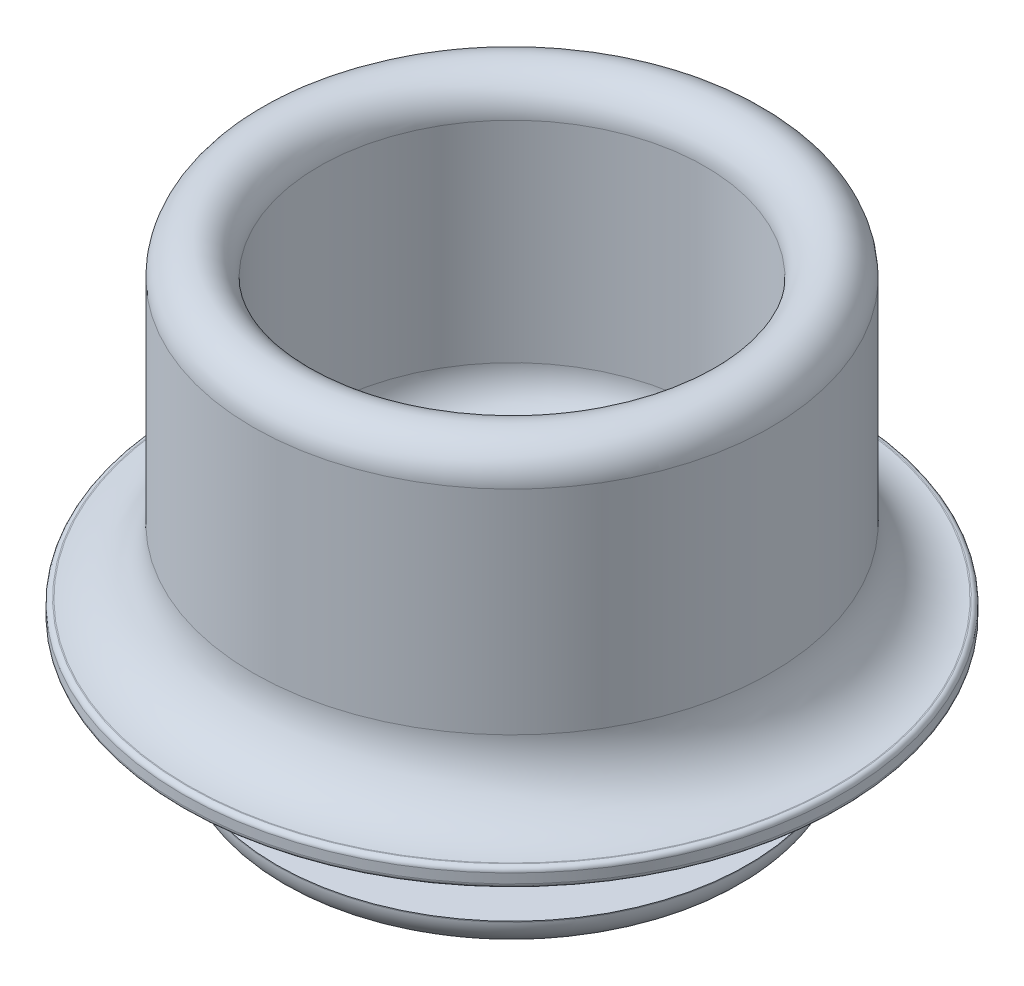
ISO-10303-21;
HEADER;
FILE_DESCRIPTION(('STEP AP214'),'2;1');
FILE_NAME('part.step','',(''),(''),'','','');
FILE_SCHEMA(('AUTOMOTIVE_DESIGN { 1 0 10303 214 1 1 1 1 }'));
ENDSEC;
DATA;
#1=APPLICATION_CONTEXT('core data for automotive mechanical design processes');
#2=APPLICATION_PROTOCOL_DEFINITION('international standard','automotive_design',2000,#1);
#3=PRODUCT_CONTEXT('',#1,'mechanical');
#4=PRODUCT('Part','Part','',(#3));
#5=PRODUCT_RELATED_PRODUCT_CATEGORY('part','',(#4));
#6=PRODUCT_DEFINITION_FORMATION('','',#4);
#7=PRODUCT_DEFINITION_CONTEXT('part definition',#1,'design');
#8=PRODUCT_DEFINITION('design','',#6,#7);
#9=PRODUCT_DEFINITION_SHAPE('','',#8);
#10=(LENGTH_UNIT() NAMED_UNIT(*) SI_UNIT(.MILLI.,.METRE.));
#11=(NAMED_UNIT(*) PLANE_ANGLE_UNIT() SI_UNIT($,.RADIAN.));
#12=(NAMED_UNIT(*) SI_UNIT($,.STERADIAN.) SOLID_ANGLE_UNIT());
#13=UNCERTAINTY_MEASURE_WITH_UNIT(LENGTH_MEASURE(1.E-05),#10,'distance_accuracy_value','');
#14=(GEOMETRIC_REPRESENTATION_CONTEXT(3) GLOBAL_UNCERTAINTY_ASSIGNED_CONTEXT((#13)) GLOBAL_UNIT_ASSIGNED_CONTEXT((#10,
#11,#12)) REPRESENTATION_CONTEXT('',''));
#15=CARTESIAN_POINT('',(0.,0.,0.));
#16=DIRECTION('',(0.,0.,1.));
#17=DIRECTION('',(1.,0.,0.));
#18=AXIS2_PLACEMENT_3D('',#15,#16,#17);
#19=CARTESIAN_POINT('',(0.,-1.31,0.));
#20=DIRECTION('',(0.,1.,0.));
#21=DIRECTION('',(-1.,0.,0.));
#22=AXIS2_PLACEMENT_3D('',#19,#20,#21);
#23=SPHERICAL_SURFACE('',#22,0.15);
#24=CARTESIAN_POINT('',(0.,-1.31,0.));
#25=DIRECTION('',(0.,1.,0.));
#26=DIRECTION('',(0.,0.,1.));
#27=AXIS2_PLACEMENT_3D('',#24,#25,#26);
#28=CIRCLE('',#27,0.15);
#29=CARTESIAN_POINT('',(0.,-1.31,0.15));
#30=VERTEX_POINT('',#29);
#31=EDGE_CURVE('E108',#30,#30,#28,.T.);
#32=ORIENTED_EDGE('',*,*,#31,.F.);
#33=EDGE_LOOP('',(#32));
#34=FACE_BOUND('',#33,.T.);
#35=ADVANCED_FACE('F35',(#34),#23,.F.);
#36=CARTESIAN_POINT('',(0.,0.3,0.));
#37=DIRECTION('',(0.,1.,0.));
#38=DIRECTION('',(0.,0.,1.));
#39=AXIS2_PLACEMENT_3D('',#36,#37,#38);
#40=PLANE('',#39);
#41=CARTESIAN_POINT('',(0.,0.3,0.));
#42=DIRECTION('',(0.,1.,0.));
#43=DIRECTION('',(0.,0.,1.));
#44=AXIS2_PLACEMENT_3D('',#41,#42,#43);
#45=CIRCLE('',#44,0.00885117110061321);
#46=CARTESIAN_POINT('',(0.,0.3,0.00885117110061321));
#47=VERTEX_POINT('',#46);
#48=EDGE_CURVE('E10',#47,#47,#45,.T.);
#49=ORIENTED_EDGE('',*,*,#48,.T.);
#50=EDGE_LOOP('',(#49));
#51=FACE_BOUND('',#50,.T.);
#52=ADVANCED_FACE('F116',(#51),#40,.T.);
#53=CARTESIAN_POINT('',(0.,0.45,0.));
#54=DIRECTION('',(0.,1.,0.));
#55=DIRECTION('',(0.,0.,1.));
#56=AXIS2_PLACEMENT_3D('',#53,#54,#55);
#57=DEGENERATE_TOROIDAL_SURFACE('',#56,0.00885117110061427,0.15,.T.);
#58=CARTESIAN_POINT('',(0.,0.45,0.));
#59=DIRECTION('',(0.,1.,0.));
#60=DIRECTION('',(0.,0.,1.));
#61=AXIS2_PLACEMENT_3D('',#58,#59,#60);
#62=CIRCLE('',#61,0.158851171100614);
#63=CARTESIAN_POINT('',(0.,0.45,0.158851171100614));
#64=VERTEX_POINT('',#63);
#65=EDGE_CURVE('E41',#64,#64,#62,.T.);
#66=ORIENTED_EDGE('',*,*,#65,.T.);
#67=EDGE_LOOP('',(#66));
#68=FACE_BOUND('',#67,.T.);
#69=ORIENTED_EDGE('',*,*,#48,.F.);
#70=EDGE_LOOP('',(#69));
#71=FACE_BOUND('',#70,.T.);
#72=ADVANCED_FACE('F120',(#68,#71),#57,.F.);
#73=CARTESIAN_POINT('',(0.,1.51318681318681,0.));
#74=DIRECTION('',(0.,1.,0.));
#75=DIRECTION('',(0.,0.,1.));
#76=AXIS2_PLACEMENT_3D('',#73,#74,#75);
#77=CYLINDRICAL_SURFACE('',#76,0.158851171100614);
#78=CARTESIAN_POINT('',(0.,0.46,0.));
#79=DIRECTION('',(0.,1.,0.));
#80=DIRECTION('',(0.,0.,1.));
#81=AXIS2_PLACEMENT_3D('',#78,#79,#80);
#82=CIRCLE('',#81,0.158851171100614);
#83=CARTESIAN_POINT('',(0.,0.46,0.158851171100614));
#84=VERTEX_POINT('',#83);
#85=EDGE_CURVE('E45',#84,#84,#82,.T.);
#86=ORIENTED_EDGE('',*,*,#85,.T.);
#87=EDGE_LOOP('',(#86));
#88=FACE_BOUND('',#87,.T.);
#89=ORIENTED_EDGE('',*,*,#65,.F.);
#90=EDGE_LOOP('',(#89));
#91=FACE_BOUND('',#90,.T.);
#92=ADVANCED_FACE('F124',(#88,#91),#77,.F.);
#93=CARTESIAN_POINT('',(0.,0.46,0.));
#94=DIRECTION('',(0.,1.,0.));
#95=DIRECTION('',(0.,0.,1.));
#96=AXIS2_PLACEMENT_3D('',#93,#94,#95);
#97=TOROIDAL_SURFACE('',#96,0.408851171100614,0.25);
#98=CARTESIAN_POINT('',(0.,0.71,0.));
#99=DIRECTION('',(0.,1.,0.));
#100=DIRECTION('',(0.,0.,1.));
#101=AXIS2_PLACEMENT_3D('',#98,#99,#100);
#102=CIRCLE('',#101,0.408851171100614);
#103=CARTESIAN_POINT('',(0.,0.71,0.408851171100614));
#104=VERTEX_POINT('',#103);
#105=EDGE_CURVE('E49',#104,#104,#102,.T.);
#106=ORIENTED_EDGE('',*,*,#105,.T.);
#107=EDGE_LOOP('',(#106));
#108=FACE_BOUND('',#107,.T.);
#109=ORIENTED_EDGE('',*,*,#85,.F.);
#110=EDGE_LOOP('',(#109));
#111=FACE_BOUND('',#110,.T.);
#112=ADVANCED_FACE('F129',(#108,#111),#97,.T.);
#113=CARTESIAN_POINT('',(-0.408851171100614,0.71,0.));
#114=DIRECTION('',(0.,1.,0.));
#115=DIRECTION('',(0.,0.,1.));
#116=AXIS2_PLACEMENT_3D('',#113,#114,#115);
#117=PLANE('',#116);
#118=CARTESIAN_POINT('',(0.,0.71,0.));
#119=DIRECTION('',(0.,1.,0.));
#120=DIRECTION('',(0.,0.,1.));
#121=AXIS2_PLACEMENT_3D('',#118,#119,#120);
#122=CIRCLE('',#121,1.);
#123=CARTESIAN_POINT('',(0.,0.71,1.));
#124=VERTEX_POINT('',#123);
#125=EDGE_CURVE('E54',#124,#124,#122,.T.);
#126=ORIENTED_EDGE('',*,*,#125,.T.);
#127=EDGE_LOOP('',(#126));
#128=FACE_BOUND('',#127,.T.);
#129=ORIENTED_EDGE('',*,*,#105,.F.);
#130=EDGE_LOOP('',(#129));
#131=FACE_BOUND('',#130,.T.);
#132=ADVANCED_FACE('F133',(#128,#131),#117,.T.);
#133=CARTESIAN_POINT('',(0.,0.46,0.));
#134=DIRECTION('',(0.,1.,0.));
#135=DIRECTION('',(0.,0.,1.));
#136=AXIS2_PLACEMENT_3D('',#133,#134,#135);
#137=TOROIDAL_SURFACE('',#136,1.,0.25);
#138=CARTESIAN_POINT('',(0.,0.46,0.));
#139=DIRECTION('',(0.,1.,0.));
#140=DIRECTION('',(0.,0.,1.));
#141=AXIS2_PLACEMENT_3D('',#138,#139,#140);
#142=CIRCLE('',#141,1.25);
#143=CARTESIAN_POINT('',(0.,0.46,1.25));
#144=VERTEX_POINT('',#143);
#145=EDGE_CURVE('E57',#144,#144,#142,.T.);
#146=ORIENTED_EDGE('',*,*,#145,.T.);
#147=EDGE_LOOP('',(#146));
#148=FACE_BOUND('',#147,.T.);
#149=ORIENTED_EDGE('',*,*,#125,.F.);
#150=EDGE_LOOP('',(#149));
#151=FACE_BOUND('',#150,.T.);
#152=ADVANCED_FACE('F137',(#148,#151),#137,.T.);
#153=CARTESIAN_POINT('',(0.,1.51318681318681,0.));
#154=DIRECTION('',(0.,1.,0.));
#155=DIRECTION('',(0.,0.,1.));
#156=AXIS2_PLACEMENT_3D('',#153,#154,#155);
#157=CYLINDRICAL_SURFACE('',#156,1.25);
#158=CARTESIAN_POINT('',(0.,0.47,0.));
#159=DIRECTION('',(0.,1.,0.));
#160=DIRECTION('',(0.,0.,1.));
#161=AXIS2_PLACEMENT_3D('',#158,#159,#160);
#162=CIRCLE('',#161,1.25);
#163=CARTESIAN_POINT('',(0.,0.47,1.25));
#164=VERTEX_POINT('',#163);
#165=EDGE_CURVE('E60',#164,#164,#162,.T.);
#166=ORIENTED_EDGE('',*,*,#165,.T.);
#167=EDGE_LOOP('',(#166));
#168=FACE_BOUND('',#167,.T.);
#169=ORIENTED_EDGE('',*,*,#145,.F.);
#170=EDGE_LOOP('',(#169));
#171=FACE_BOUND('',#170,.T.);
#172=ADVANCED_FACE('F141',(#168,#171),#157,.F.);
#173=CARTESIAN_POINT('',(-1.25,0.47,0.));
#174=DIRECTION('',(0.,1.,0.));
#175=DIRECTION('',(0.,0.,1.));
#176=AXIS2_PLACEMENT_3D('',#173,#174,#175);
#177=PLANE('',#176);
#178=CARTESIAN_POINT('',(0.,0.47,0.));
#179=DIRECTION('',(0.,1.,0.));
#180=DIRECTION('',(0.,0.,1.));
#181=AXIS2_PLACEMENT_3D('',#178,#179,#180);
#182=CIRCLE('',#181,1.6);
#183=CARTESIAN_POINT('',(0.,0.47,1.6));
#184=VERTEX_POINT('',#183);
#185=EDGE_CURVE('E63',#184,#184,#182,.T.);
#186=ORIENTED_EDGE('',*,*,#185,.T.);
#187=EDGE_LOOP('',(#186));
#188=FACE_BOUND('',#187,.T.);
#189=ORIENTED_EDGE('',*,*,#165,.F.);
#190=EDGE_LOOP('',(#189));
#191=FACE_BOUND('',#190,.T.);
#192=ADVANCED_FACE('F145',(#188,#191),#177,.T.);
#193=CARTESIAN_POINT('',(0.,0.92,0.));
#194=DIRECTION('',(0.,1.,0.));
#195=DIRECTION('',(0.,0.,1.));
#196=AXIS2_PLACEMENT_3D('',#193,#194,#195);
#197=TOROIDAL_SURFACE('',#196,1.6,0.45);
#198=CARTESIAN_POINT('',(0.,0.92,0.));
#199=DIRECTION('',(0.,1.,0.));
#200=DIRECTION('',(0.,0.,1.));
#201=AXIS2_PLACEMENT_3D('',#198,#199,#200);
#202=CIRCLE('',#201,2.05);
#203=CARTESIAN_POINT('',(0.,0.92,2.05));
#204=VERTEX_POINT('',#203);
#205=EDGE_CURVE('E66',#204,#204,#202,.T.);
#206=ORIENTED_EDGE('',*,*,#205,.T.);
#207=EDGE_LOOP('',(#206));
#208=FACE_BOUND('',#207,.T.);
#209=ORIENTED_EDGE('',*,*,#185,.F.);
#210=EDGE_LOOP('',(#209));
#211=FACE_BOUND('',#210,.T.);
#212=ADVANCED_FACE('F149',(#208,#211),#197,.F.);
#213=CARTESIAN_POINT('',(0.,1.51318681318681,0.));
#214=DIRECTION('',(0.,1.,0.));
#215=DIRECTION('',(0.,0.,1.));
#216=AXIS2_PLACEMENT_3D('',#213,#214,#215);
#217=CYLINDRICAL_SURFACE('',#216,2.05);
#218=CARTESIAN_POINT('',(0.,3.15,0.));
#219=DIRECTION('',(0.,1.,0.));
#220=DIRECTION('',(0.,0.,1.));
#221=AXIS2_PLACEMENT_3D('',#218,#219,#220);
#222=CIRCLE('',#221,2.05);
#223=CARTESIAN_POINT('',(0.,3.15,2.05));
#224=VERTEX_POINT('',#223);
#225=EDGE_CURVE('E69',#224,#224,#222,.T.);
#226=ORIENTED_EDGE('',*,*,#225,.T.);
#227=EDGE_LOOP('',(#226));
#228=FACE_BOUND('',#227,.T.);
#229=ORIENTED_EDGE('',*,*,#205,.F.);
#230=EDGE_LOOP('',(#229));
#231=FACE_BOUND('',#230,.T.);
#232=ADVANCED_FACE('F153',(#228,#231),#217,.F.);
#233=CARTESIAN_POINT('',(0.,3.15,0.));
#234=DIRECTION('',(0.,1.,0.));
#235=DIRECTION('',(0.,0.,1.));
#236=AXIS2_PLACEMENT_3D('',#233,#234,#235);
#237=TOROIDAL_SURFACE('',#236,2.4,0.35);
#238=CARTESIAN_POINT('',(0.,3.15,0.));
#239=DIRECTION('',(0.,1.,0.));
#240=DIRECTION('',(0.,0.,1.));
#241=AXIS2_PLACEMENT_3D('',#238,#239,#240);
#242=CIRCLE('',#241,2.75);
#243=CARTESIAN_POINT('',(0.,3.15,2.75));
#244=VERTEX_POINT('',#243);
#245=EDGE_CURVE('E72',#244,#244,#242,.T.);
#246=ORIENTED_EDGE('',*,*,#245,.T.);
#247=EDGE_LOOP('',(#246));
#248=FACE_BOUND('',#247,.T.);
#249=ORIENTED_EDGE('',*,*,#225,.F.);
#250=EDGE_LOOP('',(#249));
#251=FACE_BOUND('',#250,.T.);
#252=ADVANCED_FACE('F157',(#248,#251),#237,.T.);
#253=CARTESIAN_POINT('',(0.,1.51318681318681,0.));
#254=DIRECTION('',(0.,1.,0.));
#255=DIRECTION('',(0.,0.,1.));
#256=AXIS2_PLACEMENT_3D('',#253,#254,#255);
#257=CYLINDRICAL_SURFACE('',#256,2.75);
#258=CARTESIAN_POINT('',(0.,0.890000000000004,0.));
#259=DIRECTION('',(0.,1.,0.));
#260=DIRECTION('',(0.,0.,1.));
#261=AXIS2_PLACEMENT_3D('',#258,#259,#260);
#262=CIRCLE('',#261,2.75);
#263=CARTESIAN_POINT('',(0.,0.890000000000004,2.75));
#264=VERTEX_POINT('',#263);
#265=EDGE_CURVE('E75',#264,#264,#262,.T.);
#266=ORIENTED_EDGE('',*,*,#265,.T.);
#267=EDGE_LOOP('',(#266));
#268=FACE_BOUND('',#267,.T.);
#269=ORIENTED_EDGE('',*,*,#245,.F.);
#270=EDGE_LOOP('',(#269));
#271=FACE_BOUND('',#270,.T.);
#272=ADVANCED_FACE('F161',(#268,#271),#257,.T.);
#273=CARTESIAN_POINT('',(0.,0.889999999999999,0.));
#274=DIRECTION('',(0.,1.,0.));
#275=DIRECTION('',(0.,0.,1.));
#276=AXIS2_PLACEMENT_3D('',#273,#274,#275);
#277=TOROIDAL_SURFACE('',#276,3.44,0.69);
#278=CARTESIAN_POINT('',(0.,0.199999999999999,0.));
#279=DIRECTION('',(0.,1.,0.));
#280=DIRECTION('',(0.,0.,1.));
#281=AXIS2_PLACEMENT_3D('',#278,#279,#280);
#282=CIRCLE('',#281,3.44000000000001);
#283=CARTESIAN_POINT('',(0.,0.199999999999999,3.44000000000001));
#284=VERTEX_POINT('',#283);
#285=EDGE_CURVE('E78',#284,#284,#282,.T.);
#286=ORIENTED_EDGE('',*,*,#285,.T.);
#287=EDGE_LOOP('',(#286));
#288=FACE_BOUND('',#287,.T.);
#289=ORIENTED_EDGE('',*,*,#265,.F.);
#290=EDGE_LOOP('',(#289));
#291=FACE_BOUND('',#290,.T.);
#292=ADVANCED_FACE('F165',(#288,#291),#277,.F.);
#293=CARTESIAN_POINT('',(-3.45,0.199999999999999,0.));
#294=DIRECTION('',(0.,1.,0.));
#295=DIRECTION('',(0.,0.,1.));
#296=AXIS2_PLACEMENT_3D('',#293,#294,#295);
#297=PLANE('',#296);
#298=CARTESIAN_POINT('',(0.,0.199999999999999,0.));
#299=DIRECTION('',(0.,1.,0.));
#300=DIRECTION('',(0.,0.,1.));
#301=AXIS2_PLACEMENT_3D('',#298,#299,#300);
#302=CIRCLE('',#301,3.45);
#303=CARTESIAN_POINT('',(0.,0.199999999999999,3.45));
#304=VERTEX_POINT('',#303);
#305=EDGE_CURVE('E81',#304,#304,#302,.T.);
#306=ORIENTED_EDGE('',*,*,#305,.T.);
#307=EDGE_LOOP('',(#306));
#308=FACE_BOUND('',#307,.T.);
#309=ORIENTED_EDGE('',*,*,#285,.F.);
#310=EDGE_LOOP('',(#309));
#311=FACE_BOUND('',#310,.T.);
#312=ADVANCED_FACE('F169',(#308,#311),#297,.T.);
#313=CARTESIAN_POINT('',(0.,0.149999999999999,0.));
#314=DIRECTION('',(0.,1.,0.));
#315=DIRECTION('',(0.,0.,1.));
#316=AXIS2_PLACEMENT_3D('',#313,#314,#315);
#317=TOROIDAL_SURFACE('',#316,3.45,0.0499999999999999);
#318=CARTESIAN_POINT('',(0.,0.15,0.));
#319=DIRECTION('',(0.,1.,0.));
#320=DIRECTION('',(0.,0.,1.));
#321=AXIS2_PLACEMENT_3D('',#318,#319,#320);
#322=CIRCLE('',#321,3.5);
#323=CARTESIAN_POINT('',(0.,0.15,3.5));
#324=VERTEX_POINT('',#323);
#325=EDGE_CURVE('E84',#324,#324,#322,.T.);
#326=ORIENTED_EDGE('',*,*,#325,.T.);
#327=EDGE_LOOP('',(#326));
#328=FACE_BOUND('',#327,.T.);
#329=ORIENTED_EDGE('',*,*,#305,.F.);
#330=EDGE_LOOP('',(#329));
#331=FACE_BOUND('',#330,.T.);
#332=ADVANCED_FACE('F173',(#328,#331),#317,.T.);
#333=CARTESIAN_POINT('',(0.,1.51318681318681,0.));
#334=DIRECTION('',(0.,1.,0.));
#335=DIRECTION('',(0.,0.,1.));
#336=AXIS2_PLACEMENT_3D('',#333,#334,#335);
#337=CYLINDRICAL_SURFACE('',#336,3.5);
#338=CARTESIAN_POINT('',(0.,0.0499999999999995,0.));
#339=DIRECTION('',(0.,1.,0.));
#340=DIRECTION('',(0.,0.,1.));
#341=AXIS2_PLACEMENT_3D('',#338,#339,#340);
#342=CIRCLE('',#341,3.5);
#343=CARTESIAN_POINT('',(0.,0.0499999999999995,3.5));
#344=VERTEX_POINT('',#343);
#345=EDGE_CURVE('E87',#344,#344,#342,.T.);
#346=ORIENTED_EDGE('',*,*,#345,.T.);
#347=EDGE_LOOP('',(#346));
#348=FACE_BOUND('',#347,.T.);
#349=ORIENTED_EDGE('',*,*,#325,.F.);
#350=EDGE_LOOP('',(#349));
#351=FACE_BOUND('',#350,.T.);
#352=ADVANCED_FACE('F177',(#348,#351),#337,.T.);
#353=CARTESIAN_POINT('',(0.,0.0499999999999996,0.));
#354=DIRECTION('',(0.,1.,0.));
#355=DIRECTION('',(0.,0.,1.));
#356=AXIS2_PLACEMENT_3D('',#353,#354,#355);
#357=TOROIDAL_SURFACE('',#356,3.45,0.0499999999999998);
#358=CARTESIAN_POINT('',(0.,0.,0.));
#359=DIRECTION('',(0.,1.,0.));
#360=DIRECTION('',(0.,0.,1.));
#361=AXIS2_PLACEMENT_3D('',#358,#359,#360);
#362=CIRCLE('',#361,3.45);
#363=CARTESIAN_POINT('',(0.,0.,3.45));
#364=VERTEX_POINT('',#363);
#365=EDGE_CURVE('E90',#364,#364,#362,.T.);
#366=ORIENTED_EDGE('',*,*,#365,.T.);
#367=EDGE_LOOP('',(#366));
#368=FACE_BOUND('',#367,.T.);
#369=ORIENTED_EDGE('',*,*,#345,.F.);
#370=EDGE_LOOP('',(#369));
#371=FACE_BOUND('',#370,.T.);
#372=ADVANCED_FACE('F181',(#368,#371),#357,.T.);
#373=CARTESIAN_POINT('',(-1.5,0.,0.));
#374=DIRECTION('',(0.,-1.,0.));
#375=DIRECTION('',(0.,0.,-1.));
#376=AXIS2_PLACEMENT_3D('',#373,#374,#375);
#377=PLANE('',#376);
#378=CARTESIAN_POINT('',(0.,0.,0.));
#379=DIRECTION('',(0.,1.,0.));
#380=DIRECTION('',(0.,0.,1.));
#381=AXIS2_PLACEMENT_3D('',#378,#379,#380);
#382=CIRCLE('',#381,1.5);
#383=CARTESIAN_POINT('',(0.,0.,1.5));
#384=VERTEX_POINT('',#383);
#385=EDGE_CURVE('E93',#384,#384,#382,.T.);
#386=ORIENTED_EDGE('',*,*,#385,.T.);
#387=EDGE_LOOP('',(#386));
#388=FACE_BOUND('',#387,.T.);
#389=ORIENTED_EDGE('',*,*,#365,.F.);
#390=EDGE_LOOP('',(#389));
#391=FACE_BOUND('',#390,.T.);
#392=ADVANCED_FACE('F185',(#388,#391),#377,.T.);
#393=CARTESIAN_POINT('',(0.,1.51318681318681,0.));
#394=DIRECTION('',(0.,1.,0.));
#395=DIRECTION('',(0.,0.,1.));
#396=AXIS2_PLACEMENT_3D('',#393,#394,#395);
#397=CYLINDRICAL_SURFACE('',#396,1.5);
#398=CARTESIAN_POINT('',(0.,-1.,0.));
#399=DIRECTION('',(0.,1.,0.));
#400=DIRECTION('',(0.,0.,1.));
#401=AXIS2_PLACEMENT_3D('',#398,#399,#400);
#402=CIRCLE('',#401,1.5);
#403=CARTESIAN_POINT('',(0.,-1.,1.5));
#404=VERTEX_POINT('',#403);
#405=EDGE_CURVE('E96',#404,#404,#402,.T.);
#406=ORIENTED_EDGE('',*,*,#405,.T.);
#407=EDGE_LOOP('',(#406));
#408=FACE_BOUND('',#407,.T.);
#409=ORIENTED_EDGE('',*,*,#385,.F.);
#410=EDGE_LOOP('',(#409));
#411=FACE_BOUND('',#410,.T.);
#412=ADVANCED_FACE('F189',(#408,#411),#397,.T.);
#413=CARTESIAN_POINT('',(-1.5,-1.,0.));
#414=DIRECTION('',(0.,1.,0.));
#415=DIRECTION('',(0.,0.,1.));
#416=AXIS2_PLACEMENT_3D('',#413,#414,#415);
#417=PLANE('',#416);
#418=CARTESIAN_POINT('',(0.,-1.,0.));
#419=DIRECTION('',(0.,1.,0.));
#420=DIRECTION('',(0.,0.,1.));
#421=AXIS2_PLACEMENT_3D('',#418,#419,#420);
#422=CIRCLE('',#421,2.50105665899479);
#423=CARTESIAN_POINT('',(0.,-1.,2.50105665899479));
#424=VERTEX_POINT('',#423);
#425=EDGE_CURVE('E99',#424,#424,#422,.T.);
#426=ORIENTED_EDGE('',*,*,#425,.T.);
#427=EDGE_LOOP('',(#426));
#428=FACE_BOUND('',#427,.T.);
#429=ORIENTED_EDGE('',*,*,#405,.F.);
#430=EDGE_LOOP('',(#429));
#431=FACE_BOUND('',#430,.T.);
#432=ADVANCED_FACE('F193',(#428,#431),#417,.T.);
#433=CARTESIAN_POINT('',(0.,1.51318681318681,0.));
#434=DIRECTION('',(0.,1.,0.));
#435=DIRECTION('',(0.,0.,1.));
#436=AXIS2_PLACEMENT_3D('',#433,#434,#435);
#437=CYLINDRICAL_SURFACE('',#436,2.50105665899479);
#438=CARTESIAN_POINT('',(0.,-1.01,0.));
#439=DIRECTION('',(0.,1.,0.));
#440=DIRECTION('',(0.,0.,1.));
#441=AXIS2_PLACEMENT_3D('',#438,#439,#440);
#442=CIRCLE('',#441,2.50105665899479);
#443=CARTESIAN_POINT('',(0.,-1.01,2.50105665899479));
#444=VERTEX_POINT('',#443);
#445=EDGE_CURVE('E102',#444,#444,#442,.T.);
#446=ORIENTED_EDGE('',*,*,#445,.T.);
#447=EDGE_LOOP('',(#446));
#448=FACE_BOUND('',#447,.T.);
#449=ORIENTED_EDGE('',*,*,#425,.F.);
#450=EDGE_LOOP('',(#449));
#451=FACE_BOUND('',#450,.T.);
#452=ADVANCED_FACE('F197',(#448,#451),#437,.T.);
#453=CARTESIAN_POINT('',(0.,-1.01,0.));
#454=DIRECTION('',(0.,1.,0.));
#455=DIRECTION('',(0.,0.,1.));
#456=AXIS2_PLACEMENT_3D('',#453,#454,#455);
#457=TOROIDAL_SURFACE('',#456,2.20105665899479,0.3);
#458=CARTESIAN_POINT('',(0.,-1.31,0.));
#459=DIRECTION('',(0.,1.,0.));
#460=DIRECTION('',(0.,0.,1.));
#461=AXIS2_PLACEMENT_3D('',#458,#459,#460);
#462=CIRCLE('',#461,2.20105665899479);
#463=CARTESIAN_POINT('',(0.,-1.31,2.20105665899479));
#464=VERTEX_POINT('',#463);
#465=EDGE_CURVE('E105',#464,#464,#462,.T.);
#466=ORIENTED_EDGE('',*,*,#465,.T.);
#467=EDGE_LOOP('',(#466));
#468=FACE_BOUND('',#467,.T.);
#469=ORIENTED_EDGE('',*,*,#445,.F.);
#470=EDGE_LOOP('',(#469));
#471=FACE_BOUND('',#470,.T.);
#472=ADVANCED_FACE('F201',(#468,#471),#457,.T.);
#473=CARTESIAN_POINT('',(-2.20105665899479,-1.31,0.));
#474=DIRECTION('',(0.,-1.,0.));
#475=DIRECTION('',(0.,0.,-1.));
#476=AXIS2_PLACEMENT_3D('',#473,#474,#475);
#477=PLANE('',#476);
#478=ORIENTED_EDGE('',*,*,#31,.T.);
#479=EDGE_LOOP('',(#478));
#480=FACE_BOUND('',#479,.T.);
#481=ORIENTED_EDGE('',*,*,#465,.F.);
#482=EDGE_LOOP('',(#481));
#483=FACE_BOUND('',#482,.T.);
#484=ADVANCED_FACE('F112',(#480,#483),#477,.T.);
#485=CLOSED_SHELL('',(#35,#52,#72,#92,#112,#132,#152,#172,#192,#212,#232,#252,#272,#292,#312,
#332,#352,#372,#392,#412,#432,#452,#472,#484));
#486=MANIFOLD_SOLID_BREP('B2',#485);
#487=ADVANCED_BREP_SHAPE_REPRESENTATION('',(#18,#486),#14);
#488=SHAPE_DEFINITION_REPRESENTATION(#9,#487);
ENDSEC;
END-ISO-10303-21;
